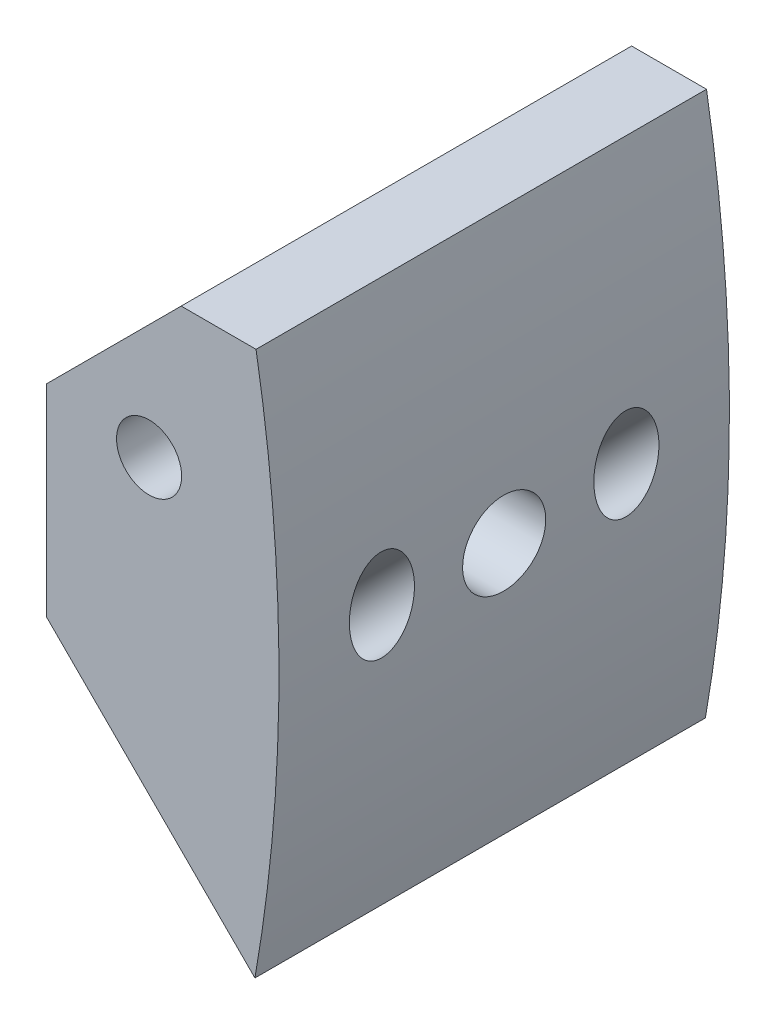
ISO-10303-21;
HEADER;
FILE_DESCRIPTION(('STEP AP214'),'2;1');
FILE_NAME('part.step','',(''),(''),'','','');
FILE_SCHEMA(('AUTOMOTIVE_DESIGN { 1 0 10303 214 1 1 1 1 }'));
ENDSEC;
DATA;
#1=APPLICATION_CONTEXT('core data for automotive mechanical design processes');
#2=APPLICATION_PROTOCOL_DEFINITION('international standard','automotive_design',2000,#1);
#3=PRODUCT_CONTEXT('',#1,'mechanical');
#4=PRODUCT('Part','Part','',(#3));
#5=PRODUCT_RELATED_PRODUCT_CATEGORY('part','',(#4));
#6=PRODUCT_DEFINITION_FORMATION('','',#4);
#7=PRODUCT_DEFINITION_CONTEXT('part definition',#1,'design');
#8=PRODUCT_DEFINITION('design','',#6,#7);
#9=PRODUCT_DEFINITION_SHAPE('','',#8);
#10=(LENGTH_UNIT() NAMED_UNIT(*) SI_UNIT(.MILLI.,.METRE.));
#11=(NAMED_UNIT(*) PLANE_ANGLE_UNIT() SI_UNIT($,.RADIAN.));
#12=(NAMED_UNIT(*) SI_UNIT($,.STERADIAN.) SOLID_ANGLE_UNIT());
#13=UNCERTAINTY_MEASURE_WITH_UNIT(LENGTH_MEASURE(1.E-05),#10,'distance_accuracy_value','');
#14=(GEOMETRIC_REPRESENTATION_CONTEXT(3) GLOBAL_UNCERTAINTY_ASSIGNED_CONTEXT((#13)) GLOBAL_UNIT_ASSIGNED_CONTEXT((#10,
#11,#12)) REPRESENTATION_CONTEXT('',''));
#15=CARTESIAN_POINT('',(0.,0.,0.));
#16=DIRECTION('',(0.,0.,1.));
#17=DIRECTION('',(1.,0.,0.));
#18=AXIS2_PLACEMENT_3D('',#15,#16,#17);
#19=CARTESIAN_POINT('',(-47.244,-6.58729003997056,18.7198));
#20=DIRECTION('',(0.,0.,-1.));
#21=DIRECTION('',(-1.,0.,0.));
#22=AXIS2_PLACEMENT_3D('',#19,#20,#21);
#23=CYLINDRICAL_SURFACE('',#22,66.294);
#24=CARTESIAN_POINT('',(19.05,-6.58729003997057,11.0871));
#25=CARTESIAN_POINT('',(19.0499996965808,-6.49029011763072,11.0870957038607));
#26=CARTESIAN_POINT('',(19.0497848234207,-6.3932202802505,11.0789012698086));
#27=CARTESIAN_POINT('',(19.0489483082885,-6.20175517058592,11.0463264377884));
#28=CARTESIAN_POINT('',(19.0483261795265,-6.10736324023725,11.0219266691839));
#29=CARTESIAN_POINT('',(19.0467456131249,-5.9240554226076,10.9576373316004));
#30=CARTESIAN_POINT('',(19.0457873390727,-5.83513689635548,10.9177552961659));
#31=CARTESIAN_POINT('',(19.0436425963866,-5.66528198959924,10.8236442233512));
#32=CARTESIAN_POINT('',(19.0424561837321,-5.58434365830945,10.7694187042804));
#33=CARTESIAN_POINT('',(19.0399882662549,-5.43269097827881,10.648135365401));
#34=CARTESIAN_POINT('',(19.0387067314511,-5.36197987388215,10.5810734891702));
#35=CARTESIAN_POINT('',(19.0361932730682,-5.2328160281673,10.4360277439134));
#36=CARTESIAN_POINT('',(19.0349613514597,-5.17436377337172,10.3580434416087));
#37=CARTESIAN_POINT('',(19.032685916437,-5.07137329412594,10.193356396944));
#38=CARTESIAN_POINT('',(19.0316424263435,-5.02683679141392,10.1066525775073));
#39=CARTESIAN_POINT('',(19.0298617644816,-4.95295334594229,9.92699542845012));
#40=CARTESIAN_POINT('',(19.0291245916354,-4.92360634973139,9.8340421208227));
#41=CARTESIAN_POINT('',(19.0280398829489,-4.8809413263353,9.64454701808837));
#42=CARTESIAN_POINT('',(19.0276922582412,-4.86761964325202,9.54800604662771));
#43=CARTESIAN_POINT('',(19.0274255738305,-4.85737214696877,9.35405747529695));
#44=CARTESIAN_POINT('',(19.0275065126475,-4.86044627714623,9.25664987842089));
#45=CARTESIAN_POINT('',(19.0280877451644,-4.88290002733904,9.06375790994818));
#46=CARTESIAN_POINT('',(19.0285879370586,-4.9022756889159,8.96827307721711));
#47=CARTESIAN_POINT('',(19.0299511275993,-4.95677637963944,8.78191186219641));
#48=CARTESIAN_POINT('',(19.0308141269425,-4.99190143902833,8.69103548875638));
#49=CARTESIAN_POINT('',(19.0328057619046,-5.07690839178007,8.51645815347474));
#50=CARTESIAN_POINT('',(19.0339344301956,-5.12679210035419,8.43275807590188));
#51=CARTESIAN_POINT('',(19.036330130382,-5.23989896873011,8.27491899974449));
#52=CARTESIAN_POINT('',(19.0375971625022,-5.30312215019547,8.20078001668767));
#53=CARTESIAN_POINT('',(19.0401272077553,-5.44113569133263,8.06414459374687));
#54=CARTESIAN_POINT('',(19.0413902195809,-5.51592948571427,8.00165162313855));
#55=CARTESIAN_POINT('',(19.0437694771187,-5.67494899416805,7.89010889306282));
#56=CARTESIAN_POINT('',(19.0448857228083,-5.75917470968648,7.84105913565682));
#57=CARTESIAN_POINT('',(19.0468456242787,-5.93466908917434,7.75779558672417));
#58=CARTESIAN_POINT('',(19.0476892780887,-6.02593780405674,7.7235819024575));
#59=CARTESIAN_POINT('',(19.0490088586277,-6.21292650873927,7.67096391731566));
#60=CARTESIAN_POINT('',(19.0494847861157,-6.30864648935182,7.65255958381096));
#61=CARTESIAN_POINT('',(19.0500151667441,-6.50179041461503,7.6320869831968));
#62=CARTESIAN_POINT('',(19.050069743725,-6.59921385015981,7.63001391611013));
#63=CARTESIAN_POINT('',(19.0497515988955,-6.79302563666371,7.64225018957412));
#64=CARTESIAN_POINT('',(19.0493788774536,-6.88941398851568,7.65655951599222));
#65=CARTESIAN_POINT('',(19.0482482255402,-7.07840609586226,7.701150411519));
#66=CARTESIAN_POINT('',(19.0474903475853,-7.17101036546318,7.73142980310495));
#67=CARTESIAN_POINT('',(19.0456747947692,-7.34982136180033,7.8070990889758));
#68=CARTESIAN_POINT('',(19.0446171194631,-7.43602807904024,7.85248900568973));
#69=CARTESIAN_POINT('',(19.0423208355982,-7.59961895748349,7.95710324508831));
#70=CARTESIAN_POINT('',(19.0410821847991,-7.67700105145836,8.0163307994683));
#71=CARTESIAN_POINT('',(19.0385636995081,-7.82072532163809,8.14693430724377));
#72=CARTESIAN_POINT('',(19.0372838649327,-7.88706747548156,8.21831028524527));
#73=CARTESIAN_POINT('',(19.0348269424432,-8.00684464408938,8.37120508147937));
#74=CARTESIAN_POINT('',(19.0336498792266,-8.06027656174518,8.45272632642443));
#75=CARTESIAN_POINT('',(19.0315315961777,-8.15269532300266,8.623585127682));
#76=CARTESIAN_POINT('',(19.0305903758834,-8.19168219490804,8.71292266867879));
#77=CARTESIAN_POINT('',(19.0290500742096,-8.25409875185362,8.89686640836887));
#78=CARTESIAN_POINT('',(19.0284509486511,-8.27753044579814,8.99147192500783));
#79=CARTESIAN_POINT('',(19.0276622613252,-8.30817809781455,9.18327581664484));
#80=CARTESIAN_POINT('',(19.0274726994678,-8.31539405945109,9.2804741910729));
#81=CARTESIAN_POINT('',(19.0275245282422,-8.31340516458679,9.47467358644387));
#82=CARTESIAN_POINT('',(19.0277657905008,-8.30420519955953,9.57167465755556));
#83=CARTESIAN_POINT('',(19.0286517995259,-8.26965564739085,9.76275500902498));
#84=CARTESIAN_POINT('',(19.0292965470955,-8.24430602810661,9.85683428356705));
#85=CARTESIAN_POINT('',(19.0309168270153,-8.17817727251902,10.0394027224271));
#86=CARTESIAN_POINT('',(19.0318923651202,-8.13739786778749,10.1278917894623));
#87=CARTESIAN_POINT('',(19.0340642058242,-8.0415692386408,10.2967653761377));
#88=CARTESIAN_POINT('',(19.0352605002712,-7.98652054112911,10.3771501948806));
#89=CARTESIAN_POINT('',(19.0377393259736,-7.86370321135577,10.5275549056016));
#90=CARTESIAN_POINT('',(19.0390218737009,-7.79593214503367,10.5975728095751));
#91=CARTESIAN_POINT('',(19.0415287850443,-7.64957731166828,10.7252560272962));
#92=CARTESIAN_POINT('',(19.0427531341612,-7.57099086895314,10.7829182752599));
#93=CARTESIAN_POINT('',(19.0450059931981,-7.4052095376815,10.8842608260837));
#94=CARTESIAN_POINT('',(19.046034383979,-7.31800946079425,10.9279326339297));
#95=CARTESIAN_POINT('',(19.0477771868896,-7.13757985767573,10.9999656701603));
#96=CARTESIAN_POINT('',(19.0484919737294,-7.04435768066933,11.0283451798781));
#97=CARTESIAN_POINT('',(19.0493357183067,-6.89000278840161,11.0614566402422));
#98=CARTESIAN_POINT('',(19.0495837449924,-6.82987223063493,11.0710608245613));
#99=CARTESIAN_POINT('',(19.0499159809689,-6.70893362867922,11.0838838509421));
#100=CARTESIAN_POINT('',(19.0500001902958,-6.64812558463983,11.0871026944142));
#101=CARTESIAN_POINT('',(19.05,-6.58729003997057,11.0871));
#102=B_SPLINE_CURVE_WITH_KNOTS('',3,(#24,#25,#26,#27,#28,#29,#30,#31,#32,#33,#34,#35,#36,#37,
#38,#39,#40,#41,#42,#43,#44,#45,#46,#47,#48,#49,#50,#51,#52,#53,#54,#55,#56,#57,#58,#59,#60,#61,
#62,#63,#64,#65,#66,#67,#68,#69,#70,#71,#72,#73,#74,#75,#76,#77,#78,#79,#80,#81,#82,#83,#84,#85,
#86,#87,#88,#89,#90,#91,#92,#93,#94,#95,#96,#97,#98,#99,#100,#101),.UNSPECIFIED.,.T.,.F.,(4,2,2,
2,2,2,2,2,2,2,2,2,2,2,2,2,2,2,2,2,2,2,2,2,2,2,2,2,2,2,2,2,2,2,2,2,2,2,4),(0.,0.290777711365592,
0.581903623562939,0.872888053476482,1.16380117397663,1.4548063782738,1.74582312964384,
2.03687587306248,2.3279275922707,2.61891290046217,2.90989720374316,3.20081086880587,
3.49172509248768,3.78267511148184,4.07362560298806,4.36466262879617,4.65569969923233,
4.94673887373656,5.23777744755217,5.52873047805297,5.81968325755811,6.11059637582465,
6.40150992590461,6.69249148509315,6.98347363365747,7.27452551839871,7.56557683284851,
7.85659055158264,8.14760420634426,8.43853116189429,8.72945869648085,9.02039129249465,
9.31131314715163,9.60229071819405,9.89334040552073,10.1845664851068,10.4754436387533,
10.6578110461634,10.84017841329),.UNSPECIFIED.);
#103=CARTESIAN_POINT('',(19.05,-6.58729003997057,11.0871));
#104=VERTEX_POINT('',#103);
#105=EDGE_CURVE('E128',#104,#104,#102,.T.);
#106=ORIENTED_EDGE('',*,*,#105,.T.);
#107=EDGE_LOOP('',(#106));
#108=FACE_BOUND('',#107,.T.);
#109=CARTESIAN_POINT('',(19.03093950099,-8.17689066280572,14.4399));
#110=CARTESIAN_POINT('',(19.0309397504888,-8.1768837360651,14.4994299092389));
#111=CARTESIAN_POINT('',(19.0310783077648,-8.17113538618393,14.5590630278307));
#112=CARTESIAN_POINT('',(19.0316118028481,-8.14864667310726,14.6762839148779));
#113=CARTESIAN_POINT('',(19.0320074198384,-8.13187718939262,14.7338658374767));
#114=CARTESIAN_POINT('',(19.0329949072261,-8.08890022916927,14.8448157281223));
#115=CARTESIAN_POINT('',(19.0335852014114,-8.06276841304479,14.8982134109924));
#116=CARTESIAN_POINT('',(19.0348944566818,-8.00273620143522,15.0003633799949));
#117=CARTESIAN_POINT('',(19.0356134275248,-7.96883521673712,15.0491153133967));
#118=CARTESIAN_POINT('',(19.0374439992075,-7.87857983434721,15.1619693773191));
#119=CARTESIAN_POINT('',(19.0385893749711,-7.8189027046317,15.2234114026122));
#120=CARTESIAN_POINT('',(19.0408509914559,-7.69052187414516,15.3360267127651));
#121=CARTESIAN_POINT('',(19.041967154257,-7.62179650096415,15.387174572624));
#122=CARTESIAN_POINT('',(19.0444749663972,-7.44905546769554,15.4983692864074));
#123=CARTESIAN_POINT('',(19.0457959560247,-7.341992528263,15.5536745420608));
#124=CARTESIAN_POINT('',(19.0479480347883,-7.12057220248546,15.646582539313));
#125=CARTESIAN_POINT('',(19.0487787239021,-7.00620894407259,15.6841708211072));
#126=CARTESIAN_POINT('',(19.0498564383536,-6.76997817793615,15.7436243327146));
#127=CARTESIAN_POINT('',(19.0500858867901,-6.64798929327224,15.7650033410691));
#128=CARTESIAN_POINT('',(19.0498557455246,-6.40218118767083,15.7907531443561));
#129=CARTESIAN_POINT('',(19.049395635741,-6.27836065501828,15.7951110926511));
#130=CARTESIAN_POINT('',(19.047618940738,-6.00612452257655,15.7858256043066));
#131=CARTESIAN_POINT('',(19.0461473478288,-5.85782262926842,15.7683452337204));
#132=CARTESIAN_POINT('',(19.0423022857426,-5.56668691032534,15.7071205546783));
#133=CARTESIAN_POINT('',(19.0399301478624,-5.42384535400006,15.6634149604779));
#134=CARTESIAN_POINT('',(19.0355406405651,-5.19998639905922,15.5683606782304));
#135=CARTESIAN_POINT('',(19.0337064139218,-5.11532901326915,15.5255267391557));
#136=CARTESIAN_POINT('',(19.0299155060611,-4.95356747771057,15.4273827974884));
#137=CARTESIAN_POINT('',(19.027959034268,-4.8764509609069,15.3720937306922));
#138=CARTESIAN_POINT('',(19.024542635703,-4.74941051854123,15.2623773367114));
#139=CARTESIAN_POINT('',(19.0230696560592,-4.69726495319206,15.2105314965473));
#140=CARTESIAN_POINT('',(19.0202826253288,-4.60195624247807,15.0991094905497));
#141=CARTESIAN_POINT('',(19.0189683855247,-4.55878238621959,15.039542682043));
#142=CARTESIAN_POINT('',(19.0168442878389,-4.49064821714003,14.9246017053715));
#143=CARTESIAN_POINT('',(19.0159863530743,-4.46381854329087,14.8703411050301));
#144=CARTESIAN_POINT('',(19.0145527172215,-4.41954414804441,14.758094370884));
#145=CARTESIAN_POINT('',(19.013976842422,-4.4020936496819,14.7001105550368));
#146=CARTESIAN_POINT('',(19.0131684031765,-4.37771401365815,14.5816521154748));
#147=CARTESIAN_POINT('',(19.0129374776606,-4.37083509949824,14.5211669953215));
#148=CARTESIAN_POINT('',(19.0128527528125,-4.36830329984476,14.3999620861377));
#149=CARTESIAN_POINT('',(19.0129988993884,-4.37264880418048,14.3392423320138));
#150=CARTESIAN_POINT('',(19.0136241974261,-4.39144250263048,14.2242810975946));
#151=CARTESIAN_POINT('',(19.014076552431,-4.40507828136987,14.1699031685768));
#152=CARTESIAN_POINT('',(19.015241347591,-4.44073747283191,14.0639978827775));
#153=CARTESIAN_POINT('',(19.0159538266458,-4.46276214007438,14.0124709536704));
#154=CARTESIAN_POINT('',(19.0176312994868,-4.51572192999796,13.9099739407884));
#155=CARTESIAN_POINT('',(19.0186096764612,-4.54714242000994,13.8592568449645));
#156=CARTESIAN_POINT('',(19.0207157564483,-4.61673228492073,13.7627203721038));
#157=CARTESIAN_POINT('',(19.0218435475059,-4.65490564355157,13.7169039118506));
#158=CARTESIAN_POINT('',(19.0247893239268,-4.75812271316617,13.6077150544386));
#159=CARTESIAN_POINT('',(19.0266591863696,-4.82676178455779,13.5477309020521));
#160=CARTESIAN_POINT('',(19.0303784714529,-4.97280178226284,13.4395477614496));
#161=CARTESIAN_POINT('',(19.0322278326506,-5.05022380333932,13.3913780646114));
#162=CARTESIAN_POINT('',(19.0363846714238,-5.23939545277268,13.2912285417164));
#163=CARTESIAN_POINT('',(19.0386232667553,-5.35361163971814,13.2439114715794));
#164=CARTESIAN_POINT('',(19.0425725957761,-5.58802140924563,13.1682090928461));
#165=CARTESIAN_POINT('',(19.0442830280784,-5.70821835939104,13.1398345827938));
#166=CARTESIAN_POINT('',(19.0470935469368,-5.95419167506842,13.1002904478532));
#167=CARTESIAN_POINT('',(19.0481788191046,-6.08003276940405,13.089528095931));
#168=CARTESIAN_POINT('',(19.04962884144,-6.33208350038818,13.0857656228831));
#169=CARTESIAN_POINT('',(19.0499928008706,-6.4582933897635,13.0927849757213));
#170=CARTESIAN_POINT('',(19.0500082655554,-6.73136712643061,13.1274798056241));
#171=CARTESIAN_POINT('',(19.0495176363884,-6.87779706126138,13.1586910103579));
#172=CARTESIAN_POINT('',(19.0476554871312,-7.16258461609257,13.2472024912822));
#173=CARTESIAN_POINT('',(19.0462858506555,-7.30095880872604,13.3044469049614));
#174=CARTESIAN_POINT('',(19.0436559695904,-7.50760963247393,13.4177007951448));
#175=CARTESIAN_POINT('',(19.0425877251546,-7.58107921862574,13.4642957488383));
#176=CARTESIAN_POINT('',(19.0403536495612,-7.72029355684979,13.5678924769256));
#177=CARTESIAN_POINT('',(19.0391879872331,-7.78605121734097,13.6248764412789));
#178=CARTESIAN_POINT('',(19.0371545918018,-7.89312224415155,13.7357716497249));
#179=CARTESIAN_POINT('',(19.0362781184018,-7.93662249090892,13.7875615527944));
#180=CARTESIAN_POINT('',(19.0346408386178,-8.0147811252408,13.8975035982089));
#181=CARTESIAN_POINT('',(19.0338799314092,-8.04944723818557,13.9556501177115));
#182=CARTESIAN_POINT('',(19.0326901777474,-8.10233142246486,14.0665400018734));
#183=CARTESIAN_POINT('',(19.0322263601696,-8.12237706763851,14.1184095431279));
#184=CARTESIAN_POINT('',(19.031497923776,-8.15351458340183,14.2247124202177));
#185=CARTESIAN_POINT('',(19.0312327782093,-8.16463013657257,14.2791385669838));
#186=CARTESIAN_POINT('',(19.0310355972113,-8.17287968059017,14.3516161549605));
#187=CARTESIAN_POINT('',(19.0309996503764,-8.17438129465964,14.3692355013328));
#188=CARTESIAN_POINT('',(19.0309515629479,-8.17638790908688,14.4045335208673));
#189=CARTESIAN_POINT('',(19.0309394268578,-8.17689272091016,14.4222122046192));
#190=CARTESIAN_POINT('',(19.03093950099,-8.17689066280572,14.4399));
#191=B_SPLINE_CURVE_WITH_KNOTS('',3,(#109,#110,#111,#112,#113,#114,#115,#116,#117,#118,#119,
#120,#121,#122,#123,#124,#125,#126,#127,#128,#129,#130,#131,#132,#133,#134,#135,#136,#137,#138,
#139,#140,#141,#142,#143,#144,#145,#146,#147,#148,#149,#150,#151,#152,#153,#154,#155,#156,#157,
#158,#159,#160,#161,#162,#163,#164,#165,#166,#167,#168,#169,#170,#171,#172,#173,#174,#175,#176,
#177,#178,#179,#180,#181,#182,#183,#184,#185,#186,#187,#188,#189,#190),.UNSPECIFIED.,.T.,.F.,(4,
2,2,2,2,2,2,2,2,2,2,2,2,2,2,2,2,2,2,2,2,2,2,2,2,2,2,2,2,2,2,2,2,2,2,2,2,2,2,2,4),(0.,
0.178506171985478,0.357485907280737,0.535050712911981,0.712628989500073,0.968185601983163,
1.22436585657519,1.58395316400955,1.94383344457158,2.3141229351464,2.68469184760297,
3.13054371649607,3.57573902268171,3.8595403991329,4.1428682476046,4.36272671799194,
4.58232118248881,4.76318425411172,4.94393579775005,5.12554343021687,5.30712501206483,
5.4745774669063,5.64205497333312,5.82039753309286,5.99884565580941,6.2708442557303,
6.54351055082748,6.91247637575032,7.28165235701933,7.6592505672792,8.03726248996462,
8.48425685284622,8.93029654053943,9.19057455638829,9.450410499051,9.65262032290752,
9.85465270454585,10.020812348109,10.1865298684965,10.2395583993646,10.2925969590509),.UNSPECIFIED.);
#192=CARTESIAN_POINT('',(19.03093950099,-8.17689066280572,14.4399));
#193=VERTEX_POINT('',#192);
#194=EDGE_CURVE('E133',#193,#193,#191,.T.);
#195=ORIENTED_EDGE('',*,*,#194,.T.);
#196=EDGE_LOOP('',(#195));
#197=FACE_BOUND('',#196,.T.);
#198=CARTESIAN_POINT('',(19.03093950099,-8.17689066280573,4.2799));
#199=CARTESIAN_POINT('',(19.0309397504888,-8.1768837360651,4.33942990923894));
#200=CARTESIAN_POINT('',(19.0310783077648,-8.17113538618393,4.39906302783068));
#201=CARTESIAN_POINT('',(19.0316118028481,-8.14864667310726,4.5162839148779));
#202=CARTESIAN_POINT('',(19.0320074198384,-8.13187718939261,4.57386583747667));
#203=CARTESIAN_POINT('',(19.0329949072261,-8.08890022916927,4.68481572812225));
#204=CARTESIAN_POINT('',(19.0335852014114,-8.06276841304479,4.73821341099244));
#205=CARTESIAN_POINT('',(19.0348944566818,-8.00273620143522,4.84036337999487));
#206=CARTESIAN_POINT('',(19.0356134275248,-7.96883521673713,4.8891153133967));
#207=CARTESIAN_POINT('',(19.0374439992075,-7.87857983434722,5.00196937731906));
#208=CARTESIAN_POINT('',(19.0385893749711,-7.8189027046317,5.06341140261225));
#209=CARTESIAN_POINT('',(19.0408509914559,-7.69052187414517,5.17602671276506));
#210=CARTESIAN_POINT('',(19.041967154257,-7.62179650096415,5.22717457262401));
#211=CARTESIAN_POINT('',(19.0444749663972,-7.44905546769554,5.33836928640741));
#212=CARTESIAN_POINT('',(19.0457959560247,-7.341992528263,5.39367454206079));
#213=CARTESIAN_POINT('',(19.0479480347883,-7.12057220248545,5.48658253931306));
#214=CARTESIAN_POINT('',(19.0487787239021,-7.00620894407258,5.52417082110725));
#215=CARTESIAN_POINT('',(19.0498564383536,-6.76997817793614,5.58362433271457));
#216=CARTESIAN_POINT('',(19.0500858867901,-6.64798929327223,5.60500334106914));
#217=CARTESIAN_POINT('',(19.0498557455246,-6.40218118767083,5.63075314435609));
#218=CARTESIAN_POINT('',(19.049395635741,-6.27836065501827,5.63511109265106));
#219=CARTESIAN_POINT('',(19.047618940738,-6.00612452257654,5.62582560430657));
#220=CARTESIAN_POINT('',(19.0461473478288,-5.85782262926841,5.60834523372035));
#221=CARTESIAN_POINT('',(19.0423022857426,-5.56668691032532,5.54712055467825));
#222=CARTESIAN_POINT('',(19.0399301478624,-5.42384535400004,5.50341496047785));
#223=CARTESIAN_POINT('',(19.0355406405651,-5.1999863990592,5.4083606782304));
#224=CARTESIAN_POINT('',(19.0337064139218,-5.11532901326913,5.36552673915568));
#225=CARTESIAN_POINT('',(19.0299155060611,-4.95356747771056,5.26738279748837));
#226=CARTESIAN_POINT('',(19.027959034268,-4.87645096090689,5.21209373069216));
#227=CARTESIAN_POINT('',(19.024542635703,-4.74941051854123,5.10237733671141));
#228=CARTESIAN_POINT('',(19.0230696560592,-4.69726495319206,5.05053149654734));
#229=CARTESIAN_POINT('',(19.0202826253287,-4.60195624247807,4.9391094905497));
#230=CARTESIAN_POINT('',(19.0189683855247,-4.55878238621958,4.87954268204304));
#231=CARTESIAN_POINT('',(19.0168442878389,-4.49064821714003,4.76460170537151));
#232=CARTESIAN_POINT('',(19.0159863530743,-4.46381854329086,4.71034110503014));
#233=CARTESIAN_POINT('',(19.0145527172215,-4.41954414804442,4.59809437088404));
#234=CARTESIAN_POINT('',(19.013976842422,-4.40209364968191,4.54011055503675));
#235=CARTESIAN_POINT('',(19.0131684031765,-4.37771401365816,4.42165211547477));
#236=CARTESIAN_POINT('',(19.0129374776605,-4.37083509949825,4.36116699532148));
#237=CARTESIAN_POINT('',(19.0128527528125,-4.36830329984476,4.23996208613772));
#238=CARTESIAN_POINT('',(19.0129988993884,-4.37264880418048,4.17924233201378));
#239=CARTESIAN_POINT('',(19.0136241974261,-4.39144250263048,4.06428109759458));
#240=CARTESIAN_POINT('',(19.014076552431,-4.40507828136988,4.00990316857683));
#241=CARTESIAN_POINT('',(19.015241347591,-4.44073747283192,3.90399788277748));
#242=CARTESIAN_POINT('',(19.0159538266458,-4.46276214007439,3.85247095367043));
#243=CARTESIAN_POINT('',(19.0176312994868,-4.51572192999796,3.74997394078837));
#244=CARTESIAN_POINT('',(19.0186096764612,-4.54714242000995,3.69925684496452));
#245=CARTESIAN_POINT('',(19.0207157564483,-4.61673228492073,3.60272037210378));
#246=CARTESIAN_POINT('',(19.0218435475059,-4.65490564355157,3.55690391185063));
#247=CARTESIAN_POINT('',(19.0247893239268,-4.75812271316617,3.44771505443856));
#248=CARTESIAN_POINT('',(19.0266591863696,-4.82676178455779,3.38773090205208));
#249=CARTESIAN_POINT('',(19.0303784714529,-4.97280178226284,3.27954776144959));
#250=CARTESIAN_POINT('',(19.0322278326506,-5.05022380333932,3.23137806461137));
#251=CARTESIAN_POINT('',(19.0363846714238,-5.23939545277268,3.13122854171636));
#252=CARTESIAN_POINT('',(19.0386232667553,-5.35361163971814,3.08391147157941));
#253=CARTESIAN_POINT('',(19.0425725957761,-5.58802140924563,3.00820909284606));
#254=CARTESIAN_POINT('',(19.0442830280784,-5.70821835939104,2.9798345827938));
#255=CARTESIAN_POINT('',(19.0470935469368,-5.95419167506842,2.94029044785315));
#256=CARTESIAN_POINT('',(19.0481788191046,-6.08003276940405,2.929528095931));
#257=CARTESIAN_POINT('',(19.04962884144,-6.33208350038818,2.92576562288308));
#258=CARTESIAN_POINT('',(19.0499928008706,-6.45829338976351,2.9327849757213));
#259=CARTESIAN_POINT('',(19.0500082655554,-6.73136712643061,2.96747980562409));
#260=CARTESIAN_POINT('',(19.0495176363884,-6.87779706126138,2.9986910103579));
#261=CARTESIAN_POINT('',(19.0476554871312,-7.16258461609258,3.08720249128223));
#262=CARTESIAN_POINT('',(19.0462858506555,-7.30095880872604,3.14444690496139));
#263=CARTESIAN_POINT('',(19.0436559695904,-7.50760963247393,3.25770079514478));
#264=CARTESIAN_POINT('',(19.0425877251546,-7.58107921862575,3.30429574883831));
#265=CARTESIAN_POINT('',(19.0403536495612,-7.7202935568498,3.40789247692563));
#266=CARTESIAN_POINT('',(19.0391879872331,-7.78605121734097,3.46487644127885));
#267=CARTESIAN_POINT('',(19.0371545918018,-7.89312224415155,3.57577164972493));
#268=CARTESIAN_POINT('',(19.0362781184018,-7.93662249090893,3.62756155279444));
#269=CARTESIAN_POINT('',(19.0346408386178,-8.01478112524081,3.73750359820893));
#270=CARTESIAN_POINT('',(19.0338799314092,-8.04944723818557,3.79565011771154));
#271=CARTESIAN_POINT('',(19.0326901777474,-8.10233142246486,3.90654000187342));
#272=CARTESIAN_POINT('',(19.0322263601696,-8.12237706763852,3.95840954312788));
#273=CARTESIAN_POINT('',(19.031497923776,-8.15351458340184,4.06471242021767));
#274=CARTESIAN_POINT('',(19.0312327782093,-8.16463013657258,4.11913856698383));
#275=CARTESIAN_POINT('',(19.0310355972113,-8.17287968059018,4.19161615496045));
#276=CARTESIAN_POINT('',(19.0309996503764,-8.17438129465966,4.20923550133283));
#277=CARTESIAN_POINT('',(19.0309515629479,-8.17638790908689,4.24453352086731));
#278=CARTESIAN_POINT('',(19.0309394268578,-8.17689272091017,4.26221220461919));
#279=CARTESIAN_POINT('',(19.03093950099,-8.17689066280573,4.2799));
#280=B_SPLINE_CURVE_WITH_KNOTS('',3,(#198,#199,#200,#201,#202,#203,#204,#205,#206,#207,#208,
#209,#210,#211,#212,#213,#214,#215,#216,#217,#218,#219,#220,#221,#222,#223,#224,#225,#226,#227,
#228,#229,#230,#231,#232,#233,#234,#235,#236,#237,#238,#239,#240,#241,#242,#243,#244,#245,#246,
#247,#248,#249,#250,#251,#252,#253,#254,#255,#256,#257,#258,#259,#260,#261,#262,#263,#264,#265,
#266,#267,#268,#269,#270,#271,#272,#273,#274,#275,#276,#277,#278,#279),.UNSPECIFIED.,.T.,.F.,(4,
2,2,2,2,2,2,2,2,2,2,2,2,2,2,2,2,2,2,2,2,2,2,2,2,2,2,2,2,2,2,2,2,2,2,2,2,2,2,2,4),(0.,
0.178506171985481,0.35748590728074,0.535050712911982,0.712628989500073,0.968185601983163,
1.22436585657519,1.58395316400956,1.94383344457159,2.31412293514641,2.68469184760298,
3.13054371649608,3.57573902268173,3.85954039913291,4.14286824760461,4.36272671799195,
4.58232118248882,4.76318425411173,4.94393579775006,5.12554343021687,5.30712501206482,
5.47457746690629,5.64205497333312,5.82039753309285,5.99884565580941,6.2708442557303,
6.54351055082748,6.91247637575032,7.28165235701932,7.6592505672792,8.03726248996462,
8.48425685284622,8.93029654053943,9.19057455638829,9.450410499051,9.65262032290752,
9.85465270454585,10.020812348109,10.1865298684965,10.2395583993646,10.2925969590509),.UNSPECIFIED.);
#281=CARTESIAN_POINT('',(19.03093950099,-8.17689066280573,4.2799));
#282=VERTEX_POINT('',#281);
#283=EDGE_CURVE('E100',#282,#282,#280,.T.);
#284=ORIENTED_EDGE('',*,*,#283,.T.);
#285=EDGE_LOOP('',(#284));
#286=FACE_BOUND('',#285,.T.);
#287=CARTESIAN_POINT('',(-47.244,-6.58729003997056,18.7198));
#288=DIRECTION('',(0.,0.,1.));
#289=DIRECTION('',(-1.,0.,0.));
#290=AXIS2_PLACEMENT_3D('',#287,#288,#289);
#291=CIRCLE('',#290,66.294);
#292=CARTESIAN_POINT('',(18.0525250935151,-18.0440891877234,18.7198));
#293=VERTEX_POINT('',#292);
#294=CARTESIAN_POINT('',(18.0983115580606,4.60541992005886,18.7198));
#295=VERTEX_POINT('',#294);
#296=EDGE_CURVE('E123',#293,#295,#291,.T.);
#297=ORIENTED_EDGE('',*,*,#296,.F.);
#298=DIRECTION('',(0.,0.,-1.));
#299=VECTOR('',#298,1.);
#300=CARTESIAN_POINT('',(18.0525250935151,-18.0440891877234,18.7198));
#301=LINE('',#300,#299);
#302=CARTESIAN_POINT('',(18.0525250935151,-18.0440891877234,0.));
#303=VERTEX_POINT('',#302);
#304=EDGE_CURVE('E99',#293,#303,#301,.T.);
#305=ORIENTED_EDGE('',*,*,#304,.T.);
#306=CARTESIAN_POINT('',(-47.244,-6.58729003997056,0.));
#307=DIRECTION('',(0.,0.,1.));
#308=DIRECTION('',(-1.,0.,0.));
#309=AXIS2_PLACEMENT_3D('',#306,#307,#308);
#310=CIRCLE('',#309,66.294);
#311=CARTESIAN_POINT('',(18.0983115580606,4.60541992005886,0.));
#312=VERTEX_POINT('',#311);
#313=EDGE_CURVE('E122',#303,#312,#310,.T.);
#314=ORIENTED_EDGE('',*,*,#313,.T.);
#315=DIRECTION('',(0.,0.,-1.));
#316=VECTOR('',#315,1.);
#317=CARTESIAN_POINT('',(18.0983115580606,4.60541992005886,18.7198));
#318=LINE('',#317,#316);
#319=EDGE_CURVE('E118',#312,#295,#318,.F.);
#320=ORIENTED_EDGE('',*,*,#319,.T.);
#321=EDGE_LOOP('',(#297,#305,#314,#320));
#322=FACE_BOUND('',#321,.T.);
#323=ADVANCED_FACE('F37',(#108,#197,#286,#322),#23,.T.);
#324=CARTESIAN_POINT('',(-47.244,-6.58729003997056,18.7198));
#325=DIRECTION('',(0.,0.,-1.));
#326=DIRECTION('',(-1.,0.,0.));
#327=AXIS2_PLACEMENT_3D('',#324,#325,#326);
#328=PLANE('',#327);
#329=CARTESIAN_POINT('',(13.6525,-1.50729003997055,18.7198));
#330=DIRECTION('',(0.,0.,1.));
#331=DIRECTION('',(1.,0.,0.));
#332=AXIS2_PLACEMENT_3D('',#329,#330,#331);
#333=CIRCLE('',#332,1.35255);
#334=CARTESIAN_POINT('',(15.00505,-1.50729003997055,18.7198));
#335=VERTEX_POINT('',#334);
#336=EDGE_CURVE('E102',#335,#335,#333,.T.);
#337=ORIENTED_EDGE('',*,*,#336,.F.);
#338=EDGE_LOOP('',(#337));
#339=FACE_BOUND('',#338,.T.);
#340=DIRECTION('',(1.,0.,0.));
#341=VECTOR('',#340,1.);
#342=CARTESIAN_POINT('',(0.,4.60541992005886,18.7198));
#343=LINE('',#342,#341);
#344=CARTESIAN_POINT('',(14.986,4.60541992005886,18.7198));
#345=VERTEX_POINT('',#344);
#346=EDGE_CURVE('E115',#345,#295,#343,.T.);
#347=ORIENTED_EDGE('',*,*,#346,.F.);
#348=DIRECTION('',(0.707106781186546,0.707106781186549,0.));
#349=VECTOR('',#348,1.);
#350=CARTESIAN_POINT('',(14.986,4.60541992005886,18.7198));
#351=LINE('',#350,#349);
#352=CARTESIAN_POINT('',(9.398,-0.982580079941157,18.7198));
#353=VERTEX_POINT('',#352);
#354=EDGE_CURVE('E59',#345,#353,#351,.F.);
#355=ORIENTED_EDGE('',*,*,#354,.T.);
#356=DIRECTION('',(0.,1.,0.));
#357=VECTOR('',#356,1.);
#358=CARTESIAN_POINT('',(9.398,4.60541992005886,18.7198));
#359=LINE('',#358,#357);
#360=CARTESIAN_POINT('',(9.398,-9.38956409420834,18.7198));
#361=VERTEX_POINT('',#360);
#362=EDGE_CURVE('E83',#361,#353,#359,.T.);
#363=ORIENTED_EDGE('',*,*,#362,.F.);
#364=DIRECTION('',(-0.707106781186548,0.707106781186547,0.));
#365=VECTOR('',#364,1.);
#366=CARTESIAN_POINT('',(7.27621774823213,-7.26778184244048,18.7198));
#367=LINE('',#366,#365);
#368=EDGE_CURVE('E94',#293,#361,#367,.T.);
#369=ORIENTED_EDGE('',*,*,#368,.F.);
#370=ORIENTED_EDGE('',*,*,#296,.T.);
#371=EDGE_LOOP('',(#347,#355,#363,#369,#370));
#372=FACE_BOUND('',#371,.T.);
#373=ADVANCED_FACE('F92',(#339,#372),#328,.F.);
#374=CARTESIAN_POINT('',(-47.244,-6.58729003997056,0.));
#375=DIRECTION('',(0.,0.,-1.));
#376=DIRECTION('',(-1.,0.,0.));
#377=AXIS2_PLACEMENT_3D('',#374,#375,#376);
#378=PLANE('',#377);
#379=DIRECTION('',(0.,1.,0.));
#380=VECTOR('',#379,1.);
#381=CARTESIAN_POINT('',(9.398,4.60541992005886,0.));
#382=LINE('',#381,#380);
#383=CARTESIAN_POINT('',(9.39800000000001,-9.38956409420835,0.));
#384=VERTEX_POINT('',#383);
#385=CARTESIAN_POINT('',(9.398,-0.982580079941164,0.));
#386=VERTEX_POINT('',#385);
#387=EDGE_CURVE('E84',#384,#386,#382,.T.);
#388=ORIENTED_EDGE('',*,*,#387,.T.);
#389=DIRECTION('',(-0.707106781186546,-0.707106781186549,0.));
#390=VECTOR('',#389,1.);
#391=CARTESIAN_POINT('',(-21.7253549800146,-32.1059350599559,0.));
#392=LINE('',#391,#390);
#393=CARTESIAN_POINT('',(14.986,4.60541992005887,0.));
#394=VERTEX_POINT('',#393);
#395=EDGE_CURVE('E11',#386,#394,#392,.F.);
#396=ORIENTED_EDGE('',*,*,#395,.T.);
#397=DIRECTION('',(1.,0.,0.));
#398=VECTOR('',#397,1.);
#399=CARTESIAN_POINT('',(0.,4.60541992005886,0.));
#400=LINE('',#399,#398);
#401=EDGE_CURVE('E116',#394,#312,#400,.T.);
#402=ORIENTED_EDGE('',*,*,#401,.T.);
#403=ORIENTED_EDGE('',*,*,#313,.F.);
#404=DIRECTION('',(0.707106781186548,-0.707106781186547,0.));
#405=VECTOR('',#404,1.);
#406=CARTESIAN_POINT('',(-20.3241370271189,20.3325729329105,0.));
#407=LINE('',#406,#405);
#408=EDGE_CURVE('E125',#384,#303,#407,.T.);
#409=ORIENTED_EDGE('',*,*,#408,.F.);
#410=EDGE_LOOP('',(#388,#396,#402,#403,#409));
#411=FACE_BOUND('',#410,.T.);
#412=CARTESIAN_POINT('',(13.6525,-1.50729003997055,0.));
#413=DIRECTION('',(0.,0.,1.));
#414=DIRECTION('',(1.,0.,0.));
#415=AXIS2_PLACEMENT_3D('',#412,#413,#414);
#416=CIRCLE('',#415,1.35255);
#417=CARTESIAN_POINT('',(15.00505,-1.50729003997055,0.));
#418=VERTEX_POINT('',#417);
#419=EDGE_CURVE('E112',#418,#418,#416,.T.);
#420=ORIENTED_EDGE('',*,*,#419,.T.);
#421=EDGE_LOOP('',(#420));
#422=FACE_BOUND('',#421,.T.);
#423=ADVANCED_FACE('F158',(#411,#422),#378,.T.);
#424=CARTESIAN_POINT('',(0.,4.60541992005886,0.));
#425=DIRECTION('',(0.,-1.,0.));
#426=DIRECTION('',(0.,0.,-1.));
#427=AXIS2_PLACEMENT_3D('',#424,#425,#426);
#428=PLANE('',#427);
#429=ORIENTED_EDGE('',*,*,#401,.F.);
#430=DIRECTION('',(0.,0.,1.));
#431=VECTOR('',#430,1.);
#432=CARTESIAN_POINT('',(14.986,4.60541992005886,0.));
#433=LINE('',#432,#431);
#434=EDGE_CURVE('E184',#394,#345,#433,.T.);
#435=ORIENTED_EDGE('',*,*,#434,.T.);
#436=ORIENTED_EDGE('',*,*,#346,.T.);
#437=ORIENTED_EDGE('',*,*,#319,.F.);
#438=EDGE_LOOP('',(#429,#435,#436,#437));
#439=FACE_BOUND('',#438,.T.);
#440=ADVANCED_FACE('F154',(#439),#428,.F.);
#441=CARTESIAN_POINT('',(13.6525,-1.50729003997055,18.7198));
#442=DIRECTION('',(0.,0.,1.));
#443=DIRECTION('',(1.,0.,0.));
#444=AXIS2_PLACEMENT_3D('',#441,#442,#443);
#445=CYLINDRICAL_SURFACE('',#444,1.35255);
#446=ORIENTED_EDGE('',*,*,#419,.F.);
#447=EDGE_LOOP('',(#446));
#448=FACE_BOUND('',#447,.T.);
#449=ORIENTED_EDGE('',*,*,#336,.T.);
#450=EDGE_LOOP('',(#449));
#451=FACE_BOUND('',#450,.T.);
#452=ADVANCED_FACE('F150',(#448,#451),#445,.F.);
#453=CARTESIAN_POINT('',(7.27621774823213,-7.26778184244048,0.));
#454=DIRECTION('',(0.707106781186547,0.707106781186548,0.));
#455=DIRECTION('',(-0.707106781186548,0.707106781186547,0.));
#456=AXIS2_PLACEMENT_3D('',#453,#454,#455);
#457=PLANE('',#456);
#458=CARTESIAN_POINT('',(12.6517357578998,-12.6432998521082,14.4399));
#459=DIRECTION('',(-0.707106781186547,-0.707106781186548,0.));
#460=DIRECTION('',(0.707106781186548,-0.707106781186547,0.));
#461=AXIS2_PLACEMENT_3D('',#458,#459,#460);
#462=CIRCLE('',#461,1.35255);
#463=CARTESIAN_POINT('',(13.6081330347937,-13.599697129002,14.4399));
#464=VERTEX_POINT('',#463);
#465=EDGE_CURVE('E88',#464,#464,#462,.T.);
#466=ORIENTED_EDGE('',*,*,#465,.F.);
#467=EDGE_LOOP('',(#466));
#468=FACE_BOUND('',#467,.T.);
#469=CARTESIAN_POINT('',(12.6517357578998,-12.6432998521082,4.2799));
#470=DIRECTION('',(-0.707106781186547,-0.707106781186548,0.));
#471=DIRECTION('',(0.707106781186548,-0.707106781186547,0.));
#472=AXIS2_PLACEMENT_3D('',#469,#470,#471);
#473=CIRCLE('',#472,1.35255);
#474=CARTESIAN_POINT('',(13.6081330347937,-13.599697129002,4.2799));
#475=VERTEX_POINT('',#474);
#476=EDGE_CURVE('E105',#475,#475,#473,.T.);
#477=ORIENTED_EDGE('',*,*,#476,.F.);
#478=EDGE_LOOP('',(#477));
#479=FACE_BOUND('',#478,.T.);
#480=ORIENTED_EDGE('',*,*,#368,.T.);
#481=DIRECTION('',(0.,0.,-1.));
#482=VECTOR('',#481,1.);
#483=CARTESIAN_POINT('',(9.398,-9.38956409420834,0.));
#484=LINE('',#483,#482);
#485=EDGE_CURVE('E81',#361,#384,#484,.T.);
#486=ORIENTED_EDGE('',*,*,#485,.T.);
#487=ORIENTED_EDGE('',*,*,#408,.T.);
#488=ORIENTED_EDGE('',*,*,#304,.F.);
#489=EDGE_LOOP('',(#480,#486,#487,#488));
#490=FACE_BOUND('',#489,.T.);
#491=ADVANCED_FACE('F97',(#468,#479,#490),#457,.F.);
#492=CARTESIAN_POINT('',(12.6517357578998,-12.6432998521082,4.2799));
#493=DIRECTION('',(-0.707106781186547,-0.707106781186548,0.));
#494=DIRECTION('',(0.707106781186548,-0.707106781186547,0.));
#495=AXIS2_PLACEMENT_3D('',#492,#493,#494);
#496=CYLINDRICAL_SURFACE('',#495,1.35255);
#497=ORIENTED_EDGE('',*,*,#476,.T.);
#498=EDGE_LOOP('',(#497));
#499=FACE_BOUND('',#498,.T.);
#500=ORIENTED_EDGE('',*,*,#283,.F.);
#501=EDGE_LOOP('',(#500));
#502=FACE_BOUND('',#501,.T.);
#503=ADVANCED_FACE('F140',(#499,#502),#496,.F.);
#504=CARTESIAN_POINT('',(12.6517357578998,-12.6432998521082,14.4399));
#505=DIRECTION('',(-0.707106781186547,-0.707106781186548,0.));
#506=DIRECTION('',(0.707106781186548,-0.707106781186547,0.));
#507=AXIS2_PLACEMENT_3D('',#504,#505,#506);
#508=CYLINDRICAL_SURFACE('',#507,1.35255);
#509=ORIENTED_EDGE('',*,*,#465,.T.);
#510=EDGE_LOOP('',(#509));
#511=FACE_BOUND('',#510,.T.);
#512=ORIENTED_EDGE('',*,*,#194,.F.);
#513=EDGE_LOOP('',(#512));
#514=FACE_BOUND('',#513,.T.);
#515=ADVANCED_FACE('F144',(#511,#514),#508,.F.);
#516=CARTESIAN_POINT('',(0.,-6.58729003997057,9.3599));
#517=DIRECTION('',(-1.,0.,0.));
#518=DIRECTION('',(0.,0.,1.));
#519=AXIS2_PLACEMENT_3D('',#516,#517,#518);
#520=CYLINDRICAL_SURFACE('',#519,1.72719999999999);
#521=CARTESIAN_POINT('',(9.398,-6.58729003997057,9.3599));
#522=DIRECTION('',(1.,0.,0.));
#523=DIRECTION('',(0.,1.,0.));
#524=AXIS2_PLACEMENT_3D('',#521,#522,#523);
#525=CIRCLE('',#524,1.72719999999999);
#526=CARTESIAN_POINT('',(9.398,-4.86009003997058,9.3599));
#527=VERTEX_POINT('',#526);
#528=EDGE_CURVE('E89',#527,#527,#525,.F.);
#529=ORIENTED_EDGE('',*,*,#528,.T.);
#530=EDGE_LOOP('',(#529));
#531=FACE_BOUND('',#530,.T.);
#532=ORIENTED_EDGE('',*,*,#105,.F.);
#533=EDGE_LOOP('',(#532));
#534=FACE_BOUND('',#533,.T.);
#535=ADVANCED_FACE('F193',(#531,#534),#520,.F.);
#536=CARTESIAN_POINT('',(9.398,4.60541992005886,0.));
#537=DIRECTION('',(1.,0.,0.));
#538=DIRECTION('',(0.,1.,0.));
#539=AXIS2_PLACEMENT_3D('',#536,#537,#538);
#540=PLANE('',#539);
#541=ORIENTED_EDGE('',*,*,#528,.F.);
#542=EDGE_LOOP('',(#541));
#543=FACE_BOUND('',#542,.T.);
#544=ORIENTED_EDGE('',*,*,#362,.T.);
#545=DIRECTION('',(0.,0.,-1.));
#546=VECTOR('',#545,1.);
#547=CARTESIAN_POINT('',(9.398,-0.982580079941157,0.));
#548=LINE('',#547,#546);
#549=EDGE_CURVE('E45',#353,#386,#548,.T.);
#550=ORIENTED_EDGE('',*,*,#549,.T.);
#551=ORIENTED_EDGE('',*,*,#387,.F.);
#552=ORIENTED_EDGE('',*,*,#485,.F.);
#553=EDGE_LOOP('',(#544,#550,#551,#552));
#554=FACE_BOUND('',#553,.T.);
#555=ADVANCED_FACE('F82',(#543,#554),#540,.F.);
#556=CARTESIAN_POINT('',(14.986,4.60541992005886,0.));
#557=DIRECTION('',(0.707106781186549,-0.707106781186546,0.));
#558=DIRECTION('',(0.707106781186546,0.707106781186549,0.));
#559=AXIS2_PLACEMENT_3D('',#556,#557,#558);
#560=PLANE('',#559);
#561=ORIENTED_EDGE('',*,*,#395,.F.);
#562=ORIENTED_EDGE('',*,*,#549,.F.);
#563=ORIENTED_EDGE('',*,*,#354,.F.);
#564=ORIENTED_EDGE('',*,*,#434,.F.);
#565=EDGE_LOOP('',(#561,#562,#563,#564));
#566=FACE_BOUND('',#565,.T.);
#567=ADVANCED_FACE('F39',(#566),#560,.F.);
#568=CLOSED_SHELL('',(#323,#373,#423,#440,#452,#491,#503,#515,#535,#555,#567));
#569=MANIFOLD_SOLID_BREP('B2',#568);
#570=ADVANCED_BREP_SHAPE_REPRESENTATION('',(#18,#569),#14);
#571=SHAPE_DEFINITION_REPRESENTATION(#9,#570);
ENDSEC;
END-ISO-10303-21;
